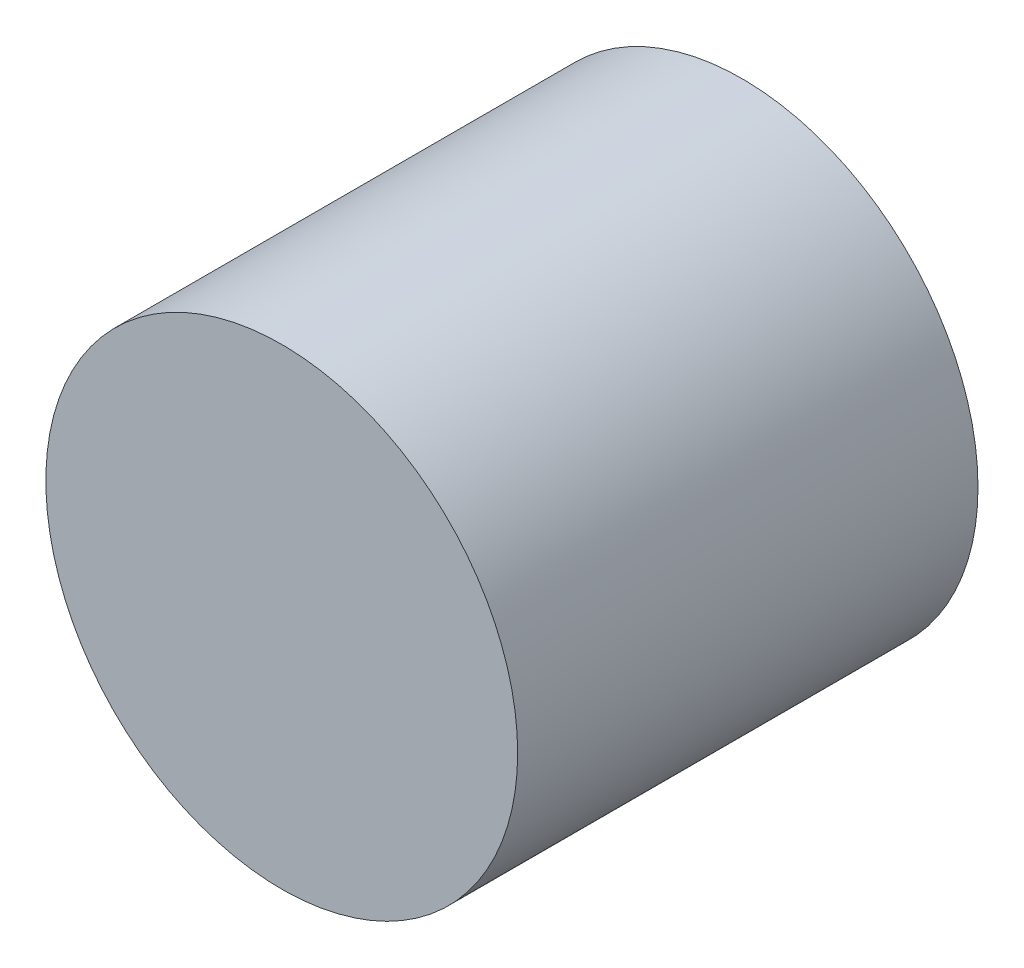
ISO-10303-21;
HEADER;
FILE_DESCRIPTION(('STEP AP214'),'2;1');
FILE_NAME('part.step','',(''),(''),'','','');
FILE_SCHEMA(('AUTOMOTIVE_DESIGN { 1 0 10303 214 1 1 1 1 }'));
ENDSEC;
DATA;
#1=APPLICATION_CONTEXT('core data for automotive mechanical design processes');
#2=APPLICATION_PROTOCOL_DEFINITION('international standard','automotive_design',2000,#1);
#3=PRODUCT_CONTEXT('',#1,'mechanical');
#4=PRODUCT('Part','Part','',(#3));
#5=PRODUCT_RELATED_PRODUCT_CATEGORY('part','',(#4));
#6=PRODUCT_DEFINITION_FORMATION('','',#4);
#7=PRODUCT_DEFINITION_CONTEXT('part definition',#1,'design');
#8=PRODUCT_DEFINITION('design','',#6,#7);
#9=PRODUCT_DEFINITION_SHAPE('','',#8);
#10=(LENGTH_UNIT() NAMED_UNIT(*) SI_UNIT(.MILLI.,.METRE.));
#11=(NAMED_UNIT(*) PLANE_ANGLE_UNIT() SI_UNIT($,.RADIAN.));
#12=(NAMED_UNIT(*) SI_UNIT($,.STERADIAN.) SOLID_ANGLE_UNIT());
#13=UNCERTAINTY_MEASURE_WITH_UNIT(LENGTH_MEASURE(1.E-05),#10,'distance_accuracy_value','');
#14=(GEOMETRIC_REPRESENTATION_CONTEXT(3) GLOBAL_UNCERTAINTY_ASSIGNED_CONTEXT((#13)) GLOBAL_UNIT_ASSIGNED_CONTEXT((#10,
#11,#12)) REPRESENTATION_CONTEXT('',''));
#15=CARTESIAN_POINT('',(0.,0.,0.));
#16=DIRECTION('',(0.,0.,1.));
#17=DIRECTION('',(1.,0.,0.));
#18=AXIS2_PLACEMENT_3D('',#15,#16,#17);
#19=CARTESIAN_POINT('',(0.,0.,0.));
#20=DIRECTION('',(0.,0.,1.));
#21=DIRECTION('',(1.,0.,0.));
#22=AXIS2_PLACEMENT_3D('',#19,#20,#21);
#23=PLANE('',#22);
#24=CARTESIAN_POINT('',(0.,0.,0.));
#25=DIRECTION('',(0.,0.,1.));
#26=DIRECTION('',(1.,0.,0.));
#27=AXIS2_PLACEMENT_3D('',#24,#25,#26);
#28=CIRCLE('',#27,4.1);
#29=CARTESIAN_POINT('',(4.1,0.,0.));
#30=VERTEX_POINT('',#29);
#31=EDGE_CURVE('E11',#30,#30,#28,.T.);
#32=ORIENTED_EDGE('',*,*,#31,.F.);
#33=EDGE_LOOP('',(#32));
#34=FACE_BOUND('',#33,.T.);
#35=ADVANCED_FACE('F38',(#34),#23,.F.);
#36=CARTESIAN_POINT('',(0.,0.,0.));
#37=DIRECTION('',(0.,0.,1.));
#38=DIRECTION('',(1.,0.,0.));
#39=AXIS2_PLACEMENT_3D('',#36,#37,#38);
#40=CYLINDRICAL_SURFACE('',#39,4.1);
#41=ORIENTED_EDGE('',*,*,#31,.T.);
#42=EDGE_LOOP('',(#41));
#43=FACE_BOUND('',#42,.T.);
#44=CARTESIAN_POINT('',(0.,0.,8.));
#45=DIRECTION('',(0.,0.,1.));
#46=DIRECTION('',(1.,0.,0.));
#47=AXIS2_PLACEMENT_3D('',#44,#45,#46);
#48=CIRCLE('',#47,4.1);
#49=CARTESIAN_POINT('',(4.1,0.,8.));
#50=VERTEX_POINT('',#49);
#51=EDGE_CURVE('E41',#50,#50,#48,.T.);
#52=ORIENTED_EDGE('',*,*,#51,.F.);
#53=EDGE_LOOP('',(#52));
#54=FACE_BOUND('',#53,.T.);
#55=ADVANCED_FACE('F52',(#43,#54),#40,.T.);
#56=CARTESIAN_POINT('',(0.,0.,8.));
#57=DIRECTION('',(0.,0.,1.));
#58=DIRECTION('',(1.,0.,0.));
#59=AXIS2_PLACEMENT_3D('',#56,#57,#58);
#60=PLANE('',#59);
#61=ORIENTED_EDGE('',*,*,#51,.T.);
#62=EDGE_LOOP('',(#61));
#63=FACE_BOUND('',#62,.T.);
#64=ADVANCED_FACE('F50',(#63),#60,.T.);
#65=CLOSED_SHELL('',(#35,#55,#64));
#66=MANIFOLD_SOLID_BREP('B2',#65);
#67=ADVANCED_BREP_SHAPE_REPRESENTATION('',(#18,#66),#14);
#68=SHAPE_DEFINITION_REPRESENTATION(#9,#67);
ENDSEC;
END-ISO-10303-21;
